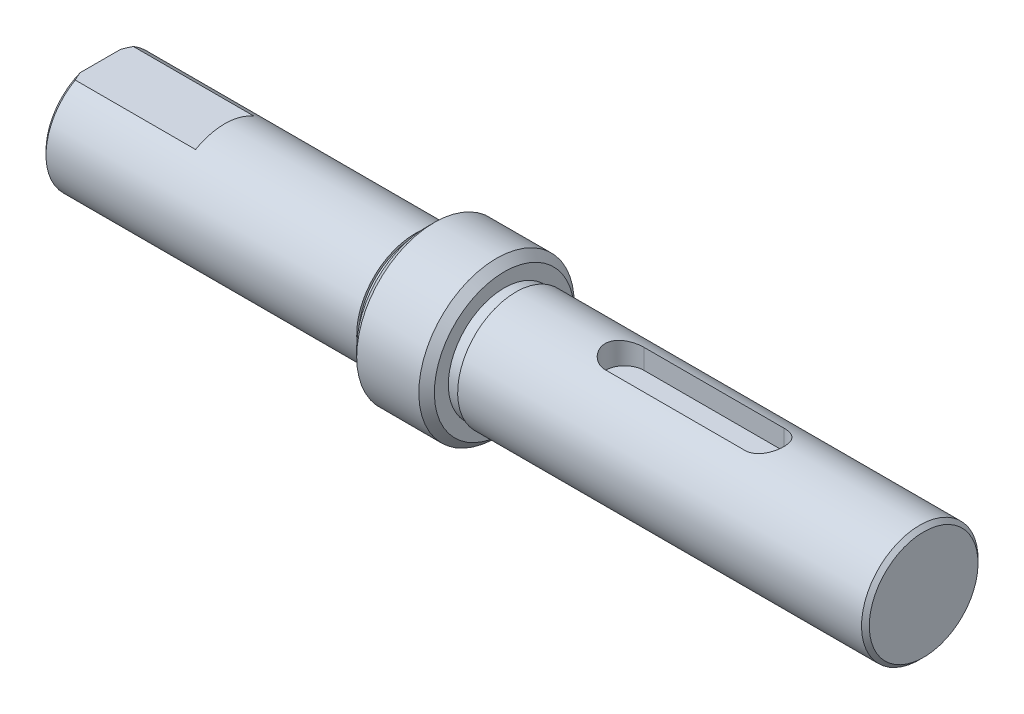
ISO-10303-21;
HEADER;
FILE_DESCRIPTION(('STEP AP214'),'2;1');
FILE_NAME('part.step','',(''),(''),'','','');
FILE_SCHEMA(('AUTOMOTIVE_DESIGN { 1 0 10303 214 1 1 1 1 }'));
ENDSEC;
DATA;
#1=APPLICATION_CONTEXT('core data for automotive mechanical design processes');
#2=APPLICATION_PROTOCOL_DEFINITION('international standard','automotive_design',2000,#1);
#3=PRODUCT_CONTEXT('',#1,'mechanical');
#4=PRODUCT('Part','Part','',(#3));
#5=PRODUCT_RELATED_PRODUCT_CATEGORY('part','',(#4));
#6=PRODUCT_DEFINITION_FORMATION('','',#4);
#7=PRODUCT_DEFINITION_CONTEXT('part definition',#1,'design');
#8=PRODUCT_DEFINITION('design','',#6,#7);
#9=PRODUCT_DEFINITION_SHAPE('','',#8);
#10=(LENGTH_UNIT() NAMED_UNIT(*) SI_UNIT(.MILLI.,.METRE.));
#11=(NAMED_UNIT(*) PLANE_ANGLE_UNIT() SI_UNIT($,.RADIAN.));
#12=(NAMED_UNIT(*) SI_UNIT($,.STERADIAN.) SOLID_ANGLE_UNIT());
#13=UNCERTAINTY_MEASURE_WITH_UNIT(LENGTH_MEASURE(1.E-05),#10,'distance_accuracy_value','');
#14=(GEOMETRIC_REPRESENTATION_CONTEXT(3) GLOBAL_UNCERTAINTY_ASSIGNED_CONTEXT((#13)) GLOBAL_UNIT_ASSIGNED_CONTEXT((#10,
#11,#12)) REPRESENTATION_CONTEXT('',''));
#15=CARTESIAN_POINT('',(0.,0.,0.));
#16=DIRECTION('',(0.,0.,1.));
#17=DIRECTION('',(1.,0.,0.));
#18=AXIS2_PLACEMENT_3D('',#15,#16,#17);
#19=CARTESIAN_POINT('',(0.,0.,0.));
#20=DIRECTION('',(1.,0.,0.));
#21=DIRECTION('',(0.,1.,0.));
#22=AXIS2_PLACEMENT_3D('',#19,#20,#21);
#23=CYLINDRICAL_SURFACE('',#22,7.49999999999996);
#24=CARTESIAN_POINT('',(105.5,0.,0.));
#25=DIRECTION('',(1.,0.,0.));
#26=DIRECTION('',(0.,1.,0.));
#27=AXIS2_PLACEMENT_3D('',#24,#25,#26);
#28=CIRCLE('',#27,7.49999999999996);
#29=CARTESIAN_POINT('',(105.5,7.49999999999997,0.));
#30=VERTEX_POINT('',#29);
#31=EDGE_CURVE('E255',#30,#30,#28,.F.);
#32=ORIENTED_EDGE('',*,*,#31,.T.);
#33=EDGE_LOOP('',(#32));
#34=FACE_BOUND('',#33,.T.);
#35=CARTESIAN_POINT('',(53.5,0.,0.));
#36=DIRECTION('',(1.,0.,0.));
#37=DIRECTION('',(0.,1.,0.));
#38=AXIS2_PLACEMENT_3D('',#35,#36,#37);
#39=CIRCLE('',#38,7.49999999999996);
#40=CARTESIAN_POINT('',(53.5,7.49999999999997,0.));
#41=VERTEX_POINT('',#40);
#42=EDGE_CURVE('E163',#41,#41,#39,.T.);
#43=ORIENTED_EDGE('',*,*,#42,.T.);
#44=EDGE_LOOP('',(#43));
#45=FACE_BOUND('',#44,.T.);
#46=DIRECTION('',(1.,0.,0.));
#47=VECTOR('',#46,1.);
#48=CARTESIAN_POINT('',(0.,7.07106781186543,2.49999999999999));
#49=LINE('',#48,#47);
#50=CARTESIAN_POINT('',(85.4999999999755,7.07106781186545,2.49999999999999));
#51=VERTEX_POINT('',#50);
#52=CARTESIAN_POINT('',(67.5000000000245,7.07106781186544,2.49999999999999));
#53=VERTEX_POINT('',#52);
#54=EDGE_CURVE('E208',#51,#53,#49,.F.);
#55=ORIENTED_EDGE('',*,*,#54,.T.);
#56=CARTESIAN_POINT('',(67.5000000000245,7.07106781186544,2.5));
#57=CARTESIAN_POINT('',(67.4317929222048,7.07105693273154,2.50000899110405));
#58=CARTESIAN_POINT('',(67.3635919253504,7.07205443904565,2.49720887221587));
#59=CARTESIAN_POINT('',(67.2277189616779,7.07598524120999,2.48606045780484));
#60=CARTESIAN_POINT('',(67.1600468570398,7.07891801450631,2.47771365997224));
#61=CARTESIAN_POINT('',(67.0259095116746,7.08662705252488,2.4555745942284));
#62=CARTESIAN_POINT('',(66.959441297479,7.09139784850095,2.44179847763194));
#63=CARTESIAN_POINT('',(66.8279917314483,7.10262619905968,2.40894181030211));
#64=CARTESIAN_POINT('',(66.7630104334419,7.1090838146029,2.38986106786142));
#65=CARTESIAN_POINT('',(66.5710384203191,7.13069940793851,2.32491551306371));
#66=CARTESIAN_POINT('',(66.4468208425649,7.14811243883975,2.27131416810479));
#67=CARTESIAN_POINT('',(66.2091231885739,7.1869703408741,2.14517784106609));
#68=CARTESIAN_POINT('',(66.0956497642582,7.20841768550949,2.07263123268959));
#69=CARTESIAN_POINT('',(65.8782070965698,7.25386182389318,1.90762995847412));
#70=CARTESIAN_POINT('',(65.7747148572734,7.2779218942789,1.81456284631521));
#71=CARTESIAN_POINT('',(65.5844828968098,7.32534626725836,1.61247071191406));
#72=CARTESIAN_POINT('',(65.4977461587253,7.34871044533307,1.50344285414663));
#73=CARTESIAN_POINT('',(65.3413017757834,7.39284706096126,1.26900922495212));
#74=CARTESIAN_POINT('',(65.2720976923043,7.41353593532672,1.14325025285825));
#75=CARTESIAN_POINT('',(65.1560192176129,7.44924021883081,0.881073095491492));
#76=CARTESIAN_POINT('',(65.1091380051223,7.46425736081023,0.74465818124342));
#77=CARTESIAN_POINT('',(65.0406607237904,7.48647677762651,0.470073371202998));
#78=CARTESIAN_POINT('',(65.0182418290916,7.49393272446042,0.332129588175044));
#79=CARTESIAN_POINT('',(64.9967092433105,7.50109021034804,0.0542474216599176));
#80=CARTESIAN_POINT('',(64.9975899991333,7.50079359709928,-0.0856904786152926));
#81=CARTESIAN_POINT('',(65.0221107104494,7.49265096581901,-0.357759612665155));
#82=CARTESIAN_POINT('',(65.0448565956535,7.48510152476627,-0.489981756399803));
#83=CARTESIAN_POINT('',(65.1109829960275,7.46367401254073,-0.748610161046758));
#84=CARTESIAN_POINT('',(65.1543646553733,7.44979559045156,-0.87501609904612));
#85=CARTESIAN_POINT('',(65.2610534242417,7.41689170678298,-1.12038155750653));
#86=CARTESIAN_POINT('',(65.3246151129044,7.39780094596236,-1.23922126409009));
#87=CARTESIAN_POINT('',(65.4696498784706,7.35645969200969,-1.46481147271656));
#88=CARTESIAN_POINT('',(65.5511278276471,7.33420833994829,-1.57155867425129));
#89=CARTESIAN_POINT('',(65.7341776250504,7.28765679857788,-1.7752433492349));
#90=CARTESIAN_POINT('',(65.8365138590707,7.26330946700836,-1.87148402898963));
#91=CARTESIAN_POINT('',(66.0561037243268,7.21618726183361,-2.04568006200839));
#92=CARTESIAN_POINT('',(66.1733621560462,7.19341289790687,-2.1236295079155));
#93=CARTESIAN_POINT('',(66.421700445921,7.15175078442236,-2.26000831393589));
#94=CARTESIAN_POINT('',(66.552958787368,7.13292537372095,-2.31813252372258));
#95=CARTESIAN_POINT('',(66.8241174440071,7.10202742656715,-2.41115057670511));
#96=CARTESIAN_POINT('',(66.9640037334613,7.08994423524141,-2.44608109009021));
#97=CARTESIAN_POINT('',(67.1710465918987,7.078413552385,-2.47914539065341));
#98=CARTESIAN_POINT('',(67.2366034746634,7.07566669238216,-2.48696265308901));
#99=CARTESIAN_POINT('',(67.3680951960257,7.07199258930222,-2.49738654012905));
#100=CARTESIAN_POINT('',(67.4340294363863,7.07106299825549,-2.49999988843846));
#101=CARTESIAN_POINT('',(67.5000000000245,7.07106781188276,-2.49999999995101));
#102=B_SPLINE_CURVE_WITH_KNOTS('',3,(#56,#57,#58,#59,#60,#61,#62,#63,#64,#65,#66,#67,#68,#69,
#70,#71,#72,#73,#74,#75,#76,#77,#78,#79,#80,#81,#82,#83,#84,#85,#86,#87,#88,#89,#90,#91,#92,#93,
#94,#95,#96,#97,#98,#99,#100,#101),.UNSPECIFIED.,.F.,.F.,(4,2,2,2,2,2,2,2,2,2,2,2,2,2,2,2,2,2,2,
2,2,2,4),(0.,0.204546211836545,0.409037215419591,0.612924429422994,0.816819012797305,
1.22401016922043,1.63145179963908,2.05327864086357,2.47518051338611,2.90809434011585,
3.34087579481239,3.75860278496568,4.17623021754306,4.57747647841692,4.97874498947627,
5.38529148741531,5.79194868148139,6.21771736820877,6.6436233729839,7.07581676494909,
7.50732520391436,7.70536340005967,7.90314555496476),.UNSPECIFIED.);
#103=CARTESIAN_POINT('',(67.5000000000245,7.07106781188276,-2.49999999995102));
#104=VERTEX_POINT('',#103);
#105=EDGE_CURVE('E233',#53,#104,#102,.T.);
#106=ORIENTED_EDGE('',*,*,#105,.T.);
#107=DIRECTION('',(1.,0.,0.));
#108=VECTOR('',#107,1.);
#109=CARTESIAN_POINT('',(0.,7.07106781188275,-2.49999999995102));
#110=LINE('',#109,#108);
#111=CARTESIAN_POINT('',(85.4999999999755,7.07106781188276,-2.49999999995102));
#112=VERTEX_POINT('',#111);
#113=EDGE_CURVE('E196',#104,#112,#110,.T.);
#114=ORIENTED_EDGE('',*,*,#113,.T.);
#115=CARTESIAN_POINT('',(85.4999999999755,7.07106781188276,-2.49999999995102));
#116=CARTESIAN_POINT('',(85.5682070777952,7.07105693274886,-2.50000899105508));
#117=CARTESIAN_POINT('',(85.6364080746497,7.07205443906295,-2.49720887216689));
#118=CARTESIAN_POINT('',(85.7722810383224,7.07598524122721,-2.48606045775583));
#119=CARTESIAN_POINT('',(85.8399531429607,7.07891801452348,-2.4777136599232));
#120=CARTESIAN_POINT('',(85.9740904883261,7.0866270525419,-2.45557459417929));
#121=CARTESIAN_POINT('',(86.0405587025218,7.09139784851787,-2.44179847758279));
#122=CARTESIAN_POINT('',(86.1720082685527,7.10262619907638,-2.40894181025286));
#123=CARTESIAN_POINT('',(86.2369895665592,7.10908381461948,-2.38986106781211));
#124=CARTESIAN_POINT('',(86.4289615796823,7.13069940795466,-2.32491551301418));
#125=CARTESIAN_POINT('',(86.5531791574367,7.14811243885555,-2.27131416805508));
#126=CARTESIAN_POINT('',(86.7908768114281,7.18697034088907,-2.14517784101594));
#127=CARTESIAN_POINT('',(86.904350235744,7.20841768552399,-2.07263123263916));
#128=CARTESIAN_POINT('',(87.1217929034326,7.25386182390658,-1.90762995842318));
#129=CARTESIAN_POINT('',(87.2252851427289,7.27792189429166,-1.81456284626404));
#130=CARTESIAN_POINT('',(87.4155171031925,7.32534626726973,-1.61247071186241));
#131=CARTESIAN_POINT('',(87.5022538412769,7.3487104453437,-1.50344285409472));
#132=CARTESIAN_POINT('',(87.6586982242185,7.39284706097022,-1.26900922489994));
#133=CARTESIAN_POINT('',(87.7279023076974,7.41353593533477,-1.14325025280607));
#134=CARTESIAN_POINT('',(87.8439807823883,7.44924021883697,-0.881073095439405));
#135=CARTESIAN_POINT('',(87.8908619948786,7.46425736081542,-0.744658181191417));
#136=CARTESIAN_POINT('',(87.9593392762101,7.48647677762975,-0.470073371151302));
#137=CARTESIAN_POINT('',(87.9817581709087,7.4939327244627,-0.332129588123572));
#138=CARTESIAN_POINT('',(88.0032907566895,7.50109021034841,-0.0542474216089764));
#139=CARTESIAN_POINT('',(88.0024100008667,7.5007935970987,0.0856904786659269));
#140=CARTESIAN_POINT('',(87.9778892895505,7.49265096581661,0.357759612715348));
#141=CARTESIAN_POINT('',(87.9551434043463,7.48510152476299,0.489981756449861));
#142=CARTESIAN_POINT('',(87.8890170039723,7.46367401253574,0.748610161096512));
#143=CARTESIAN_POINT('',(87.8456353446265,7.44979559044573,0.875016099095706));
#144=CARTESIAN_POINT('',(87.738946575758,7.41689170677551,1.120381557556));
#145=CARTESIAN_POINT('',(87.6753848870953,7.39780094595407,1.2392212641396));
#146=CARTESIAN_POINT('',(87.530350121529,7.35645969199982,1.46481147276614));
#147=CARTESIAN_POINT('',(87.4488721723524,7.33420833993767,1.57155867430089));
#148=CARTESIAN_POINT('',(87.2658223749489,7.28765679856578,1.77524334928462));
#149=CARTESIAN_POINT('',(87.1634861409284,7.26330946699554,1.87148402903943));
#150=CARTESIAN_POINT('',(86.9438962756719,7.21618726181946,2.04568006205831));
#151=CARTESIAN_POINT('',(86.8266378439522,7.19341289789212,2.12362950796546));
#152=CARTESIAN_POINT('',(86.5782995540771,7.15175078440659,2.26000831398581));
#153=CARTESIAN_POINT('',(86.4470412126299,7.13292537370475,2.31813252377243));
#154=CARTESIAN_POINT('',(86.1758825559905,7.10202742655029,2.41115057675478));
#155=CARTESIAN_POINT('',(86.035996266536,7.08994423522431,2.44608109013977));
#156=CARTESIAN_POINT('',(85.828953408099,7.07841355236775,2.47914539070268));
#157=CARTESIAN_POINT('',(85.7633965253347,7.07566669236488,2.48696265313817));
#158=CARTESIAN_POINT('',(85.6319048039734,7.07199258928491,2.49738654017806));
#159=CARTESIAN_POINT('',(85.5659705636132,7.07106299823817,2.49999988848744));
#160=CARTESIAN_POINT('',(85.4999999999755,7.07106781186545,2.49999999999999));
#161=B_SPLINE_CURVE_WITH_KNOTS('',3,(#115,#116,#117,#118,#119,#120,#121,#122,#123,#124,#125,
#126,#127,#128,#129,#130,#131,#132,#133,#134,#135,#136,#137,#138,#139,#140,#141,#142,#143,#144,
#145,#146,#147,#148,#149,#150,#151,#152,#153,#154,#155,#156,#157,#158,#159,#160),.UNSPECIFIED.,
.F.,.F.,(4,2,2,2,2,2,2,2,2,2,2,2,2,2,2,2,2,2,2,2,2,2,4),(0.,0.204546211836823,0.409037215420173,
0.612924429423895,0.816819012798513,1.22401016922227,1.63145179964155,2.05327864086614,
2.4751805133888,2.90809434011778,3.34087579481357,3.75860278496595,4.17623021754244,
4.57747647841607,4.9787449894752,5.38529148741479,5.7919486814814,6.21771736820969,
6.64362337298575,7.07581676495143,7.50732520391718,7.70536340006106,7.90314555496476),.UNSPECIFIED.);
#162=EDGE_CURVE('E199',#112,#51,#161,.T.);
#163=ORIENTED_EDGE('',*,*,#162,.T.);
#164=EDGE_LOOP('',(#55,#106,#114,#163));
#165=FACE_BOUND('',#164,.T.);
#166=ADVANCED_FACE('F34',(#34,#45,#165),#23,.T.);
#167=CARTESIAN_POINT('',(0.,0.,0.));
#168=DIRECTION('',(-1.,0.,0.));
#169=DIRECTION('',(0.,-1.,0.));
#170=AXIS2_PLACEMENT_3D('',#167,#168,#169);
#171=PLANE('',#170);
#172=CARTESIAN_POINT('',(0.,0.,0.));
#173=DIRECTION('',(-1.,0.,0.));
#174=DIRECTION('',(0.,0.,1.));
#175=AXIS2_PLACEMENT_3D('',#172,#173,#174);
#176=CIRCLE('',#175,2.5);
#177=CARTESIAN_POINT('',(0.,0.,2.5));
#178=VERTEX_POINT('',#177);
#179=EDGE_CURVE('E347',#178,#178,#176,.T.);
#180=ORIENTED_EDGE('',*,*,#179,.F.);
#181=EDGE_LOOP('',(#180));
#182=FACE_BOUND('',#181,.T.);
#183=DIRECTION('',(0.,0.,1.));
#184=VECTOR('',#183,1.);
#185=CARTESIAN_POINT('',(0.,6.5,-9.99999999999997));
#186=LINE('',#185,#184);
#187=CARTESIAN_POINT('',(0.,6.5,-2.59807621135322));
#188=VERTEX_POINT('',#187);
#189=CARTESIAN_POINT('',(0.,6.5,2.59807621135322));
#190=VERTEX_POINT('',#189);
#191=EDGE_CURVE('E157',#188,#190,#186,.T.);
#192=ORIENTED_EDGE('',*,*,#191,.F.);
#193=CARTESIAN_POINT('',(0.,0.,0.));
#194=DIRECTION('',(-1.,0.,0.));
#195=DIRECTION('',(0.,-1.,0.));
#196=AXIS2_PLACEMENT_3D('',#193,#194,#195);
#197=CIRCLE('',#196,6.99999999999996);
#198=CARTESIAN_POINT('',(0.,-6.5,-2.59807621135322));
#199=VERTEX_POINT('',#198);
#200=EDGE_CURVE('E61',#188,#199,#197,.T.);
#201=ORIENTED_EDGE('',*,*,#200,.T.);
#202=DIRECTION('',(0.,0.,1.));
#203=VECTOR('',#202,1.);
#204=CARTESIAN_POINT('',(0.,-6.5,-9.99999999999997));
#205=LINE('',#204,#203);
#206=CARTESIAN_POINT('',(0.,-6.5,2.59807621135322));
#207=VERTEX_POINT('',#206);
#208=EDGE_CURVE('E155',#199,#207,#205,.T.);
#209=ORIENTED_EDGE('',*,*,#208,.T.);
#210=CARTESIAN_POINT('',(0.,0.,0.));
#211=DIRECTION('',(-1.,0.,0.));
#212=DIRECTION('',(0.,-1.,0.));
#213=AXIS2_PLACEMENT_3D('',#210,#211,#212);
#214=CIRCLE('',#213,6.99999999999996);
#215=EDGE_CURVE('E351',#207,#190,#214,.T.);
#216=ORIENTED_EDGE('',*,*,#215,.T.);
#217=EDGE_LOOP('',(#192,#201,#209,#216));
#218=FACE_BOUND('',#217,.T.);
#219=ADVANCED_FACE('F296',(#182,#218),#171,.T.);
#220=CARTESIAN_POINT('',(0.,0.,0.));
#221=DIRECTION('',(1.,0.,0.));
#222=DIRECTION('',(0.,1.,0.));
#223=AXIS2_PLACEMENT_3D('',#220,#221,#222);
#224=CYLINDRICAL_SURFACE('',#223,7.49999999999997);
#225=DIRECTION('',(1.,0.,0.));
#226=VECTOR('',#225,1.);
#227=CARTESIAN_POINT('',(0.,-6.5,-3.74165738677388));
#228=LINE('',#227,#226);
#229=CARTESIAN_POINT('',(0.500000000000006,-6.5,-3.74165738677388));
#230=VERTEX_POINT('',#229);
#231=CARTESIAN_POINT('',(16.,-6.5,-3.74165738677388));
#232=VERTEX_POINT('',#231);
#233=EDGE_CURVE('E192',#230,#232,#228,.T.);
#234=ORIENTED_EDGE('',*,*,#233,.F.);
#235=CARTESIAN_POINT('',(0.500000000000005,0.,0.));
#236=DIRECTION('',(-1.,0.,0.));
#237=DIRECTION('',(0.,-1.,0.));
#238=AXIS2_PLACEMENT_3D('',#235,#236,#237);
#239=CIRCLE('',#238,7.49999999999997);
#240=CARTESIAN_POINT('',(0.500000000000004,6.5,-3.74165738677388));
#241=VERTEX_POINT('',#240);
#242=EDGE_CURVE('E261',#230,#241,#239,.F.);
#243=ORIENTED_EDGE('',*,*,#242,.T.);
#244=DIRECTION('',(1.,0.,0.));
#245=VECTOR('',#244,1.);
#246=CARTESIAN_POINT('',(0.,6.5,-3.74165738677388));
#247=LINE('',#246,#245);
#248=CARTESIAN_POINT('',(16.,6.5,-3.74165738677388));
#249=VERTEX_POINT('',#248);
#250=EDGE_CURVE('E187',#249,#241,#247,.F.);
#251=ORIENTED_EDGE('',*,*,#250,.F.);
#252=CARTESIAN_POINT('',(16.,0.,0.));
#253=DIRECTION('',(1.,0.,0.));
#254=DIRECTION('',(0.,1.,0.));
#255=AXIS2_PLACEMENT_3D('',#252,#253,#254);
#256=CIRCLE('',#255,7.49999999999997);
#257=CARTESIAN_POINT('',(16.,6.5,3.74165738677388));
#258=VERTEX_POINT('',#257);
#259=EDGE_CURVE('E185',#258,#249,#256,.F.);
#260=ORIENTED_EDGE('',*,*,#259,.F.);
#261=DIRECTION('',(1.,0.,0.));
#262=VECTOR('',#261,1.);
#263=CARTESIAN_POINT('',(0.,6.5,3.74165738677388));
#264=LINE('',#263,#262);
#265=CARTESIAN_POINT('',(0.500000000000004,6.5,3.74165738677388));
#266=VERTEX_POINT('',#265);
#267=EDGE_CURVE('E183',#266,#258,#264,.T.);
#268=ORIENTED_EDGE('',*,*,#267,.F.);
#269=CARTESIAN_POINT('',(0.500000000000005,0.,0.));
#270=DIRECTION('',(-1.,0.,0.));
#271=DIRECTION('',(0.,-1.,0.));
#272=AXIS2_PLACEMENT_3D('',#269,#270,#271);
#273=CIRCLE('',#272,7.49999999999997);
#274=CARTESIAN_POINT('',(0.500000000000006,-6.5,3.74165738677388));
#275=VERTEX_POINT('',#274);
#276=EDGE_CURVE('E258',#266,#275,#273,.F.);
#277=ORIENTED_EDGE('',*,*,#276,.T.);
#278=DIRECTION('',(1.,0.,0.));
#279=VECTOR('',#278,1.);
#280=CARTESIAN_POINT('',(0.,-6.5,3.74165738677388));
#281=LINE('',#280,#279);
#282=CARTESIAN_POINT('',(16.,-6.5,3.74165738677388));
#283=VERTEX_POINT('',#282);
#284=EDGE_CURVE('E194',#283,#275,#281,.F.);
#285=ORIENTED_EDGE('',*,*,#284,.F.);
#286=CARTESIAN_POINT('',(16.,0.,0.));
#287=DIRECTION('',(1.,0.,0.));
#288=DIRECTION('',(0.,0.,-1.));
#289=AXIS2_PLACEMENT_3D('',#286,#287,#288);
#290=CIRCLE('',#289,7.49999999999997);
#291=EDGE_CURVE('E190',#232,#283,#290,.F.);
#292=ORIENTED_EDGE('',*,*,#291,.F.);
#293=EDGE_LOOP('',(#234,#243,#251,#260,#268,#277,#285,#292));
#294=FACE_BOUND('',#293,.T.);
#295=CARTESIAN_POINT('',(40.5,0.,0.));
#296=DIRECTION('',(1.,0.,0.));
#297=DIRECTION('',(0.,1.,0.));
#298=AXIS2_PLACEMENT_3D('',#295,#296,#297);
#299=CIRCLE('',#298,7.49999999999996);
#300=CARTESIAN_POINT('',(40.5,7.49999999999997,0.));
#301=VERTEX_POINT('',#300);
#302=EDGE_CURVE('E180',#301,#301,#299,.T.);
#303=ORIENTED_EDGE('',*,*,#302,.F.);
#304=EDGE_LOOP('',(#303));
#305=FACE_BOUND('',#304,.T.);
#306=ADVANCED_FACE('F301',(#294,#305),#224,.T.);
#307=CARTESIAN_POINT('',(40.5,7.49999999999997,0.));
#308=DIRECTION('',(1.,0.,0.));
#309=DIRECTION('',(0.,1.,0.));
#310=AXIS2_PLACEMENT_3D('',#307,#308,#309);
#311=PLANE('',#310);
#312=ORIENTED_EDGE('',*,*,#302,.T.);
#313=EDGE_LOOP('',(#312));
#314=FACE_BOUND('',#313,.T.);
#315=CARTESIAN_POINT('',(40.5,0.,0.));
#316=DIRECTION('',(1.,0.,0.));
#317=DIRECTION('',(0.,1.,0.));
#318=AXIS2_PLACEMENT_3D('',#315,#316,#317);
#319=CIRCLE('',#318,7.19999999999996);
#320=CARTESIAN_POINT('',(40.5,7.19999999999997,0.));
#321=VERTEX_POINT('',#320);
#322=EDGE_CURVE('E177',#321,#321,#319,.T.);
#323=ORIENTED_EDGE('',*,*,#322,.F.);
#324=EDGE_LOOP('',(#323));
#325=FACE_BOUND('',#324,.T.);
#326=ADVANCED_FACE('F518',(#314,#325),#311,.T.);
#327=CARTESIAN_POINT('',(0.,0.,0.));
#328=DIRECTION('',(1.,0.,0.));
#329=DIRECTION('',(0.,1.,0.));
#330=AXIS2_PLACEMENT_3D('',#327,#328,#329);
#331=CYLINDRICAL_SURFACE('',#330,7.19999999999996);
#332=ORIENTED_EDGE('',*,*,#322,.T.);
#333=EDGE_LOOP('',(#332));
#334=FACE_BOUND('',#333,.T.);
#335=CARTESIAN_POINT('',(42.,0.,0.));
#336=DIRECTION('',(1.,0.,0.));
#337=DIRECTION('',(0.,1.,0.));
#338=AXIS2_PLACEMENT_3D('',#335,#336,#337);
#339=CIRCLE('',#338,7.19999999999996);
#340=CARTESIAN_POINT('',(42.,7.19999999999997,0.));
#341=VERTEX_POINT('',#340);
#342=EDGE_CURVE('E174',#341,#341,#339,.T.);
#343=ORIENTED_EDGE('',*,*,#342,.F.);
#344=EDGE_LOOP('',(#343));
#345=FACE_BOUND('',#344,.T.);
#346=ADVANCED_FACE('F460',(#334,#345),#331,.T.);
#347=CARTESIAN_POINT('',(42.,7.19999999999997,0.));
#348=DIRECTION('',(-1.,0.,0.));
#349=DIRECTION('',(0.,-1.,0.));
#350=AXIS2_PLACEMENT_3D('',#347,#348,#349);
#351=PLANE('',#350);
#352=CARTESIAN_POINT('',(42.,0.,0.));
#353=DIRECTION('',(-1.,0.,0.));
#354=DIRECTION('',(0.,-1.,0.));
#355=AXIS2_PLACEMENT_3D('',#352,#353,#354);
#356=CIRCLE('',#355,8.99999999999998);
#357=CARTESIAN_POINT('',(42.,-8.99999999999997,0.));
#358=VERTEX_POINT('',#357);
#359=EDGE_CURVE('E249',#358,#358,#356,.T.);
#360=ORIENTED_EDGE('',*,*,#359,.T.);
#361=EDGE_LOOP('',(#360));
#362=FACE_BOUND('',#361,.T.);
#363=ORIENTED_EDGE('',*,*,#342,.T.);
#364=EDGE_LOOP('',(#363));
#365=FACE_BOUND('',#364,.T.);
#366=ADVANCED_FACE('F454',(#362,#365),#351,.T.);
#367=CARTESIAN_POINT('',(0.,0.,0.));
#368=DIRECTION('',(1.,0.,0.));
#369=DIRECTION('',(0.,1.,0.));
#370=AXIS2_PLACEMENT_3D('',#367,#368,#369);
#371=CYLINDRICAL_SURFACE('',#370,9.99999999999997);
#372=CARTESIAN_POINT('',(51.,0.,0.));
#373=DIRECTION('',(1.,0.,0.));
#374=DIRECTION('',(0.,1.,0.));
#375=AXIS2_PLACEMENT_3D('',#372,#373,#374);
#376=CIRCLE('',#375,9.99999999999997);
#377=CARTESIAN_POINT('',(51.,9.99999999999998,0.));
#378=VERTEX_POINT('',#377);
#379=EDGE_CURVE('E246',#378,#378,#376,.F.);
#380=ORIENTED_EDGE('',*,*,#379,.T.);
#381=EDGE_LOOP('',(#380));
#382=FACE_BOUND('',#381,.T.);
#383=CARTESIAN_POINT('',(43.,0.,0.));
#384=DIRECTION('',(-1.,0.,0.));
#385=DIRECTION('',(0.,-1.,0.));
#386=AXIS2_PLACEMENT_3D('',#383,#384,#385);
#387=CIRCLE('',#386,9.99999999999997);
#388=CARTESIAN_POINT('',(43.,-9.99999999999997,0.));
#389=VERTEX_POINT('',#388);
#390=EDGE_CURVE('E243',#389,#389,#387,.F.);
#391=ORIENTED_EDGE('',*,*,#390,.T.);
#392=EDGE_LOOP('',(#391));
#393=FACE_BOUND('',#392,.T.);
#394=ADVANCED_FACE('F459',(#382,#393),#371,.T.);
#395=CARTESIAN_POINT('',(52.,9.99999999999998,0.));
#396=DIRECTION('',(1.,0.,0.));
#397=DIRECTION('',(0.,1.,0.));
#398=AXIS2_PLACEMENT_3D('',#395,#396,#397);
#399=PLANE('',#398);
#400=CARTESIAN_POINT('',(52.,0.,0.));
#401=DIRECTION('',(1.,0.,0.));
#402=DIRECTION('',(0.,1.,0.));
#403=AXIS2_PLACEMENT_3D('',#400,#401,#402);
#404=CIRCLE('',#403,8.99999999999998);
#405=CARTESIAN_POINT('',(52.,8.99999999999998,0.));
#406=VERTEX_POINT('',#405);
#407=EDGE_CURVE('E240',#406,#406,#404,.T.);
#408=ORIENTED_EDGE('',*,*,#407,.T.);
#409=EDGE_LOOP('',(#408));
#410=FACE_BOUND('',#409,.T.);
#411=CARTESIAN_POINT('',(52.,0.,0.));
#412=DIRECTION('',(1.,0.,0.));
#413=DIRECTION('',(0.,1.,0.));
#414=AXIS2_PLACEMENT_3D('',#411,#412,#413);
#415=CIRCLE('',#414,7.19999999999996);
#416=CARTESIAN_POINT('',(52.,7.19999999999997,0.));
#417=VERTEX_POINT('',#416);
#418=EDGE_CURVE('E171',#417,#417,#415,.T.);
#419=ORIENTED_EDGE('',*,*,#418,.F.);
#420=EDGE_LOOP('',(#419));
#421=FACE_BOUND('',#420,.T.);
#422=ADVANCED_FACE('F472',(#410,#421),#399,.T.);
#423=CARTESIAN_POINT('',(0.,0.,0.));
#424=DIRECTION('',(1.,0.,0.));
#425=DIRECTION('',(0.,1.,0.));
#426=AXIS2_PLACEMENT_3D('',#423,#424,#425);
#427=CYLINDRICAL_SURFACE('',#426,7.19999999999996);
#428=ORIENTED_EDGE('',*,*,#418,.T.);
#429=EDGE_LOOP('',(#428));
#430=FACE_BOUND('',#429,.T.);
#431=CARTESIAN_POINT('',(53.5,0.,0.));
#432=DIRECTION('',(1.,0.,0.));
#433=DIRECTION('',(0.,1.,0.));
#434=AXIS2_PLACEMENT_3D('',#431,#432,#433);
#435=CIRCLE('',#434,7.19999999999996);
#436=CARTESIAN_POINT('',(53.5,7.19999999999997,0.));
#437=VERTEX_POINT('',#436);
#438=EDGE_CURVE('E168',#437,#437,#435,.T.);
#439=ORIENTED_EDGE('',*,*,#438,.F.);
#440=EDGE_LOOP('',(#439));
#441=FACE_BOUND('',#440,.T.);
#442=ADVANCED_FACE('F293',(#430,#441),#427,.T.);
#443=CARTESIAN_POINT('',(53.5,7.19999999999997,0.));
#444=DIRECTION('',(-1.,0.,0.));
#445=DIRECTION('',(0.,-1.,0.));
#446=AXIS2_PLACEMENT_3D('',#443,#444,#445);
#447=PLANE('',#446);
#448=ORIENTED_EDGE('',*,*,#438,.T.);
#449=EDGE_LOOP('',(#448));
#450=FACE_BOUND('',#449,.T.);
#451=ORIENTED_EDGE('',*,*,#42,.F.);
#452=EDGE_LOOP('',(#451));
#453=FACE_BOUND('',#452,.T.);
#454=ADVANCED_FACE('F288',(#450,#453),#447,.T.);
#455=CARTESIAN_POINT('',(106.,7.49999999999997,0.));
#456=DIRECTION('',(1.,0.,0.));
#457=DIRECTION('',(0.,1.,0.));
#458=AXIS2_PLACEMENT_3D('',#455,#456,#457);
#459=PLANE('',#458);
#460=CARTESIAN_POINT('',(106.,0.,0.));
#461=DIRECTION('',(1.,0.,0.));
#462=DIRECTION('',(0.,1.,0.));
#463=AXIS2_PLACEMENT_3D('',#460,#461,#462);
#464=CIRCLE('',#463,6.99999999999998);
#465=CARTESIAN_POINT('',(106.,6.99999999999999,0.));
#466=VERTEX_POINT('',#465);
#467=EDGE_CURVE('E252',#466,#466,#464,.T.);
#468=ORIENTED_EDGE('',*,*,#467,.T.);
#469=EDGE_LOOP('',(#468));
#470=FACE_BOUND('',#469,.T.);
#471=ADVANCED_FACE('F285',(#470),#459,.T.);
#472=CARTESIAN_POINT('',(16.,6.5,-9.99999999999997));
#473=DIRECTION('',(1.,0.,0.));
#474=DIRECTION('',(0.,1.,0.));
#475=AXIS2_PLACEMENT_3D('',#472,#473,#474);
#476=PLANE('',#475);
#477=ORIENTED_EDGE('',*,*,#259,.T.);
#478=DIRECTION('',(0.,0.,1.));
#479=VECTOR('',#478,1.);
#480=CARTESIAN_POINT('',(16.,6.5,-9.99999999999997));
#481=LINE('',#480,#479);
#482=EDGE_CURVE('E160',#249,#258,#481,.T.);
#483=ORIENTED_EDGE('',*,*,#482,.T.);
#484=EDGE_LOOP('',(#477,#483));
#485=FACE_BOUND('',#484,.T.);
#486=ADVANCED_FACE('F281',(#485),#476,.F.);
#487=CARTESIAN_POINT('',(16.,6.5,-9.99999999999997));
#488=DIRECTION('',(0.,-1.,0.));
#489=DIRECTION('',(1.,0.,0.));
#490=AXIS2_PLACEMENT_3D('',#487,#488,#489);
#491=PLANE('',#490);
#492=ORIENTED_EDGE('',*,*,#250,.T.);
#493=CARTESIAN_POINT('',(0.500000000000004,6.5,-3.74165738677388));
#494=CARTESIAN_POINT('',(0.453535504056639,6.5,-3.64851517289647));
#495=CARTESIAN_POINT('',(0.408107259758502,6.5,-3.55484974318803));
#496=CARTESIAN_POINT('',(0.319591651075269,6.5,-3.36650238385657));
#497=CARTESIAN_POINT('',(0.276502629455996,6.5,-3.27182123231758));
#498=CARTESIAN_POINT('',(0.192863066931701,6.5,-3.08133102900943));
#499=CARTESIAN_POINT('',(0.152312731418809,6.5,-2.98552188672339));
#500=CARTESIAN_POINT('',(0.0739933775286053,6.5,-2.79269458247037));
#501=CARTESIAN_POINT('',(0.0362263787623943,6.5,-2.69567560116993));
#502=CARTESIAN_POINT('',(0.,6.5,-2.59807621135322));
#503=B_SPLINE_CURVE_WITH_KNOTS('',3,(#493,#494,#495,#496,#497,#498,#499,#500,#501,#502),
.UNSPECIFIED.,.F.,.F.,(4,2,2,2,4),(0.,0.312267207174203,0.624310219975612,0.936378446045579,
1.24867092620927),.UNSPECIFIED.);
#504=EDGE_CURVE('E271',#241,#188,#503,.T.);
#505=ORIENTED_EDGE('',*,*,#504,.T.);
#506=ORIENTED_EDGE('',*,*,#191,.T.);
#507=CARTESIAN_POINT('',(0.,6.5,2.59807621135322));
#508=CARTESIAN_POINT('',(0.0362263787623942,6.5,2.69567560116993));
#509=CARTESIAN_POINT('',(0.0739933775286053,6.5,2.79269458247037));
#510=CARTESIAN_POINT('',(0.152312731418809,6.5,2.98552188672339));
#511=CARTESIAN_POINT('',(0.1928630669317,6.5,3.08133102900943));
#512=CARTESIAN_POINT('',(0.276502629455995,6.5,3.27182123231758));
#513=CARTESIAN_POINT('',(0.319591651075269,6.5,3.36650238385657));
#514=CARTESIAN_POINT('',(0.408107259758502,6.5,3.55484974318803));
#515=CARTESIAN_POINT('',(0.453535504056639,6.5,3.64851517289647));
#516=CARTESIAN_POINT('',(0.500000000000004,6.5,3.74165738677387));
#517=B_SPLINE_CURVE_WITH_KNOTS('',3,(#507,#508,#509,#510,#511,#512,#513,#514,#515,#516),
.UNSPECIFIED.,.F.,.F.,(4,2,2,2,4),(0.,0.31229248016369,0.624360706233656,0.936403719035065,
1.24867092620927),.UNSPECIFIED.);
#518=EDGE_CURVE('E264',#190,#266,#517,.T.);
#519=ORIENTED_EDGE('',*,*,#518,.T.);
#520=ORIENTED_EDGE('',*,*,#267,.T.);
#521=ORIENTED_EDGE('',*,*,#482,.F.);
#522=EDGE_LOOP('',(#492,#505,#506,#519,#520,#521));
#523=FACE_BOUND('',#522,.T.);
#524=ADVANCED_FACE('F277',(#523),#491,.F.);
#525=CARTESIAN_POINT('',(0.,-6.5,-9.99999999999997));
#526=DIRECTION('',(0.,1.,0.));
#527=DIRECTION('',(-1.,0.,0.));
#528=AXIS2_PLACEMENT_3D('',#525,#526,#527);
#529=PLANE('',#528);
#530=ORIENTED_EDGE('',*,*,#208,.F.);
#531=CARTESIAN_POINT('',(0.,-6.5,-2.59807621135322));
#532=CARTESIAN_POINT('',(0.0362263787623959,-6.5,-2.69567560116993));
#533=CARTESIAN_POINT('',(0.073993377528607,-6.5,-2.79269458247037));
#534=CARTESIAN_POINT('',(0.15231273141881,-6.5,-2.98552188672339));
#535=CARTESIAN_POINT('',(0.192863066931702,-6.5,-3.08133102900943));
#536=CARTESIAN_POINT('',(0.276502629455997,-6.5,-3.27182123231758));
#537=CARTESIAN_POINT('',(0.319591651075271,-6.5,-3.36650238385657));
#538=CARTESIAN_POINT('',(0.408107259758504,-6.5,-3.55484974318803));
#539=CARTESIAN_POINT('',(0.453535504056641,-6.5,-3.64851517289647));
#540=CARTESIAN_POINT('',(0.500000000000006,-6.5,-3.74165738677388));
#541=B_SPLINE_CURVE_WITH_KNOTS('',3,(#531,#532,#533,#534,#535,#536,#537,#538,#539,#540),
.UNSPECIFIED.,.F.,.F.,(4,2,2,2,4),(0.,0.31229248016369,0.624360706233656,0.936403719035065,
1.24867092620927),.UNSPECIFIED.);
#542=EDGE_CURVE('E11',#199,#230,#541,.T.);
#543=ORIENTED_EDGE('',*,*,#542,.T.);
#544=ORIENTED_EDGE('',*,*,#233,.T.);
#545=DIRECTION('',(0.,0.,1.));
#546=VECTOR('',#545,1.);
#547=CARTESIAN_POINT('',(16.,-6.5,-9.99999999999997));
#548=LINE('',#547,#546);
#549=EDGE_CURVE('E154',#232,#283,#548,.T.);
#550=ORIENTED_EDGE('',*,*,#549,.T.);
#551=ORIENTED_EDGE('',*,*,#284,.T.);
#552=CARTESIAN_POINT('',(0.500000000000006,-6.5,3.74165738677388));
#553=CARTESIAN_POINT('',(0.45353550405664,-6.5,3.64851517289647));
#554=CARTESIAN_POINT('',(0.408107259758504,-6.5,3.55484974318803));
#555=CARTESIAN_POINT('',(0.319591651075271,-6.5,3.36650238385657));
#556=CARTESIAN_POINT('',(0.276502629455997,-6.5,3.27182123231758));
#557=CARTESIAN_POINT('',(0.192863066931702,-6.5,3.08133102900943));
#558=CARTESIAN_POINT('',(0.152312731418811,-6.5,2.98552188672339));
#559=CARTESIAN_POINT('',(0.0739933775286069,-6.5,2.79269458247037));
#560=CARTESIAN_POINT('',(0.0362263787623957,-6.5,2.69567560116993));
#561=CARTESIAN_POINT('',(0.,-6.5,2.59807621135322));
#562=B_SPLINE_CURVE_WITH_KNOTS('',3,(#552,#553,#554,#555,#556,#557,#558,#559,#560,#561),
.UNSPECIFIED.,.F.,.F.,(4,2,2,2,4),(0.,0.312267207174203,0.624310219975612,0.936378446045579,
1.24867092620927),.UNSPECIFIED.);
#563=EDGE_CURVE('E48',#275,#207,#562,.T.);
#564=ORIENTED_EDGE('',*,*,#563,.T.);
#565=EDGE_LOOP('',(#530,#543,#544,#550,#551,#564));
#566=FACE_BOUND('',#565,.T.);
#567=ADVANCED_FACE('F230',(#566),#529,.F.);
#568=CARTESIAN_POINT('',(16.,-6.5,-9.99999999999997));
#569=DIRECTION('',(1.,0.,0.));
#570=DIRECTION('',(0.,0.,-1.));
#571=AXIS2_PLACEMENT_3D('',#568,#569,#570);
#572=PLANE('',#571);
#573=ORIENTED_EDGE('',*,*,#291,.T.);
#574=ORIENTED_EDGE('',*,*,#549,.F.);
#575=EDGE_LOOP('',(#573,#574));
#576=FACE_BOUND('',#575,.T.);
#577=ADVANCED_FACE('F228',(#576),#572,.F.);
#578=CARTESIAN_POINT('',(67.5000000000245,9.99999999999998,2.44929359829471E-11));
#579=DIRECTION('',(0.,-1.,0.));
#580=DIRECTION('',(0.,0.,-1.));
#581=AXIS2_PLACEMENT_3D('',#578,#579,#580);
#582=CYLINDRICAL_SURFACE('',#581,2.49999999997551);
#583=DIRECTION('',(0.,-1.,0.));
#584=VECTOR('',#583,1.);
#585=CARTESIAN_POINT('',(67.5000000000245,9.99999999999998,2.49999999999999));
#586=LINE('',#585,#584);
#587=CARTESIAN_POINT('',(67.5000000000245,4.5,2.49999999999999));
#588=VERTEX_POINT('',#587);
#589=EDGE_CURVE('E152',#53,#588,#586,.T.);
#590=ORIENTED_EDGE('',*,*,#589,.T.);
#591=CARTESIAN_POINT('',(67.5000000000245,4.5,2.44929359829471E-11));
#592=DIRECTION('',(0.,1.,0.));
#593=DIRECTION('',(0.,0.,1.));
#594=AXIS2_PLACEMENT_3D('',#591,#592,#593);
#595=CIRCLE('',#594,2.49999999997551);
#596=CARTESIAN_POINT('',(67.5000000000245,4.5,-2.49999999995102));
#597=VERTEX_POINT('',#596);
#598=EDGE_CURVE('E127',#597,#588,#595,.T.);
#599=ORIENTED_EDGE('',*,*,#598,.F.);
#600=DIRECTION('',(0.,-1.,0.));
#601=VECTOR('',#600,1.);
#602=CARTESIAN_POINT('',(67.5000000000245,9.99999999999998,-2.49999999995102));
#603=LINE('',#602,#601);
#604=EDGE_CURVE('E146',#104,#597,#603,.T.);
#605=ORIENTED_EDGE('',*,*,#604,.F.);
#606=ORIENTED_EDGE('',*,*,#105,.F.);
#607=EDGE_LOOP('',(#590,#599,#605,#606));
#608=FACE_BOUND('',#607,.T.);
#609=ADVANCED_FACE('F224',(#608),#582,.F.);
#610=CARTESIAN_POINT('',(67.5000000000245,9.99999999999998,2.49999999999999));
#611=DIRECTION('',(0.,0.,-1.));
#612=DIRECTION('',(-1.,0.,0.));
#613=AXIS2_PLACEMENT_3D('',#610,#611,#612);
#614=PLANE('',#613);
#615=DIRECTION('',(0.,-1.,0.));
#616=VECTOR('',#615,1.);
#617=CARTESIAN_POINT('',(85.4999999999755,9.99999999999998,2.49999999999999));
#618=LINE('',#617,#616);
#619=CARTESIAN_POINT('',(85.4999999999755,4.5,2.49999999999999));
#620=VERTEX_POINT('',#619);
#621=EDGE_CURVE('E150',#51,#620,#618,.T.);
#622=ORIENTED_EDGE('',*,*,#621,.T.);
#623=DIRECTION('',(1.,0.,0.));
#624=VECTOR('',#623,1.);
#625=CARTESIAN_POINT('',(67.5000000000245,4.5,2.49999999999999));
#626=LINE('',#625,#624);
#627=EDGE_CURVE('E131',#588,#620,#626,.T.);
#628=ORIENTED_EDGE('',*,*,#627,.F.);
#629=ORIENTED_EDGE('',*,*,#589,.F.);
#630=ORIENTED_EDGE('',*,*,#54,.F.);
#631=EDGE_LOOP('',(#622,#628,#629,#630));
#632=FACE_BOUND('',#631,.T.);
#633=ADVANCED_FACE('F219',(#632),#614,.T.);
#634=CARTESIAN_POINT('',(85.4999999999755,9.99999999999998,2.44846083847129E-11));
#635=DIRECTION('',(0.,-1.,0.));
#636=DIRECTION('',(0.,0.,-1.));
#637=AXIS2_PLACEMENT_3D('',#634,#635,#636);
#638=CYLINDRICAL_SURFACE('',#637,2.49999999997551);
#639=DIRECTION('',(0.,-1.,0.));
#640=VECTOR('',#639,1.);
#641=CARTESIAN_POINT('',(85.4999999999755,9.99999999999998,-2.49999999995102));
#642=LINE('',#641,#640);
#643=CARTESIAN_POINT('',(85.4999999999755,4.5,-2.49999999995102));
#644=VERTEX_POINT('',#643);
#645=EDGE_CURVE('E148',#112,#644,#642,.T.);
#646=ORIENTED_EDGE('',*,*,#645,.T.);
#647=CARTESIAN_POINT('',(85.4999999999755,4.5,2.44846083847129E-11));
#648=DIRECTION('',(0.,1.,0.));
#649=DIRECTION('',(0.,0.,1.));
#650=AXIS2_PLACEMENT_3D('',#647,#648,#649);
#651=CIRCLE('',#650,2.49999999997551);
#652=EDGE_CURVE('E140',#620,#644,#651,.T.);
#653=ORIENTED_EDGE('',*,*,#652,.F.);
#654=ORIENTED_EDGE('',*,*,#621,.F.);
#655=ORIENTED_EDGE('',*,*,#162,.F.);
#656=EDGE_LOOP('',(#646,#653,#654,#655));
#657=FACE_BOUND('',#656,.T.);
#658=ADVANCED_FACE('F213',(#657),#638,.F.);
#659=CARTESIAN_POINT('',(67.5000000000245,9.99999999999998,-2.49999999995102));
#660=DIRECTION('',(0.,0.,1.));
#661=DIRECTION('',(1.,0.,0.));
#662=AXIS2_PLACEMENT_3D('',#659,#660,#661);
#663=PLANE('',#662);
#664=ORIENTED_EDGE('',*,*,#604,.T.);
#665=DIRECTION('',(-1.,0.,0.));
#666=VECTOR('',#665,1.);
#667=CARTESIAN_POINT('',(67.5000000000245,4.5,-2.49999999995102));
#668=LINE('',#667,#666);
#669=EDGE_CURVE('E143',#644,#597,#668,.T.);
#670=ORIENTED_EDGE('',*,*,#669,.F.);
#671=ORIENTED_EDGE('',*,*,#645,.F.);
#672=ORIENTED_EDGE('',*,*,#113,.F.);
#673=EDGE_LOOP('',(#664,#670,#671,#672));
#674=FACE_BOUND('',#673,.T.);
#675=ADVANCED_FACE('F218',(#674),#663,.T.);
#676=CARTESIAN_POINT('',(67.5000000000245,4.5,2.44929359829471E-11));
#677=DIRECTION('',(0.,1.,0.));
#678=DIRECTION('',(0.,0.,1.));
#679=AXIS2_PLACEMENT_3D('',#676,#677,#678);
#680=PLANE('',#679);
#681=ORIENTED_EDGE('',*,*,#598,.T.);
#682=ORIENTED_EDGE('',*,*,#627,.T.);
#683=ORIENTED_EDGE('',*,*,#652,.T.);
#684=ORIENTED_EDGE('',*,*,#669,.T.);
#685=EDGE_LOOP('',(#681,#682,#683,#684));
#686=FACE_BOUND('',#685,.T.);
#687=ADVANCED_FACE('F121',(#686),#680,.T.);
#688=CARTESIAN_POINT('',(14.,0.,0.));
#689=DIRECTION('',(-1.,0.,0.));
#690=DIRECTION('',(0.,0.,1.));
#691=AXIS2_PLACEMENT_3D('',#688,#689,#690);
#692=CONICAL_SURFACE('',#691,2.1,1.02974425867665);
#693=CARTESIAN_POINT('',(15.2618072999579,0.,0.));
#694=VERTEX_POINT('',#693);
#695=VERTEX_LOOP('',#694);
#696=FACE_BOUND('',#695,.T.);
#697=CARTESIAN_POINT('',(14.,0.,0.));
#698=DIRECTION('',(-1.,0.,0.));
#699=DIRECTION('',(0.,0.,1.));
#700=AXIS2_PLACEMENT_3D('',#697,#698,#699);
#701=CIRCLE('',#700,2.1);
#702=CARTESIAN_POINT('',(14.,0.,2.1));
#703=VERTEX_POINT('',#702);
#704=EDGE_CURVE('E125',#703,#703,#701,.T.);
#705=ORIENTED_EDGE('',*,*,#704,.T.);
#706=EDGE_LOOP('',(#705));
#707=FACE_BOUND('',#706,.T.);
#708=ADVANCED_FACE('F117',(#696,#707),#692,.F.);
#709=CARTESIAN_POINT('',(0.,0.,0.));
#710=DIRECTION('',(-1.,0.,0.));
#711=DIRECTION('',(0.,0.,1.));
#712=AXIS2_PLACEMENT_3D('',#709,#710,#711);
#713=CYLINDRICAL_SURFACE('',#712,2.1);
#714=ORIENTED_EDGE('',*,*,#704,.F.);
#715=EDGE_LOOP('',(#714));
#716=FACE_BOUND('',#715,.T.);
#717=CARTESIAN_POINT('',(10.,0.,0.));
#718=DIRECTION('',(-1.,0.,0.));
#719=DIRECTION('',(0.,0.,1.));
#720=AXIS2_PLACEMENT_3D('',#717,#718,#719);
#721=CIRCLE('',#720,2.1);
#722=CARTESIAN_POINT('',(10.,0.,2.1));
#723=VERTEX_POINT('',#722);
#724=EDGE_CURVE('E128',#723,#723,#721,.T.);
#725=ORIENTED_EDGE('',*,*,#724,.T.);
#726=EDGE_LOOP('',(#725));
#727=FACE_BOUND('',#726,.T.);
#728=ADVANCED_FACE('F120',(#716,#727),#713,.F.);
#729=CARTESIAN_POINT('',(10.,2.1,0.));
#730=DIRECTION('',(1.,0.,0.));
#731=DIRECTION('',(0.,0.,-1.));
#732=AXIS2_PLACEMENT_3D('',#729,#730,#731);
#733=PLANE('',#732);
#734=ORIENTED_EDGE('',*,*,#724,.F.);
#735=EDGE_LOOP('',(#734));
#736=FACE_BOUND('',#735,.T.);
#737=CARTESIAN_POINT('',(10.,0.,0.));
#738=DIRECTION('',(-1.,0.,0.));
#739=DIRECTION('',(0.,0.,1.));
#740=AXIS2_PLACEMENT_3D('',#737,#738,#739);
#741=CIRCLE('',#740,2.5);
#742=CARTESIAN_POINT('',(10.,0.,2.5));
#743=VERTEX_POINT('',#742);
#744=EDGE_CURVE('E134',#743,#743,#741,.T.);
#745=ORIENTED_EDGE('',*,*,#744,.T.);
#746=EDGE_LOOP('',(#745));
#747=FACE_BOUND('',#746,.T.);
#748=ADVANCED_FACE('F328',(#736,#747),#733,.F.);
#749=CARTESIAN_POINT('',(0.,0.,0.));
#750=DIRECTION('',(-1.,0.,0.));
#751=DIRECTION('',(0.,0.,1.));
#752=AXIS2_PLACEMENT_3D('',#749,#750,#751);
#753=CYLINDRICAL_SURFACE('',#752,2.5);
#754=ORIENTED_EDGE('',*,*,#744,.F.);
#755=EDGE_LOOP('',(#754));
#756=FACE_BOUND('',#755,.T.);
#757=ORIENTED_EDGE('',*,*,#179,.T.);
#758=EDGE_LOOP('',(#757));
#759=FACE_BOUND('',#758,.T.);
#760=ADVANCED_FACE('F331',(#756,#759),#753,.F.);
#761=CARTESIAN_POINT('',(52.,0.,0.));
#762=DIRECTION('',(-1.,0.,0.));
#763=DIRECTION('',(0.,-1.,0.));
#764=AXIS2_PLACEMENT_3D('',#761,#762,#763);
#765=CONICAL_SURFACE('',#764,8.99999999999998,0.785398163397451);
#766=ORIENTED_EDGE('',*,*,#379,.F.);
#767=EDGE_LOOP('',(#766));
#768=FACE_BOUND('',#767,.T.);
#769=ORIENTED_EDGE('',*,*,#407,.F.);
#770=EDGE_LOOP('',(#769));
#771=FACE_BOUND('',#770,.T.);
#772=ADVANCED_FACE('F334',(#768,#771),#765,.T.);
#773=CARTESIAN_POINT('',(43.,0.,0.));
#774=DIRECTION('',(1.,0.,0.));
#775=DIRECTION('',(0.,1.,0.));
#776=AXIS2_PLACEMENT_3D('',#773,#774,#775);
#777=CONICAL_SURFACE('',#776,9.99999999999997,0.785398163397451);
#778=ORIENTED_EDGE('',*,*,#359,.F.);
#779=EDGE_LOOP('',(#778));
#780=FACE_BOUND('',#779,.T.);
#781=ORIENTED_EDGE('',*,*,#390,.F.);
#782=EDGE_LOOP('',(#781));
#783=FACE_BOUND('',#782,.T.);
#784=ADVANCED_FACE('F339',(#780,#783),#777,.T.);
#785=CARTESIAN_POINT('',(106.,0.,0.));
#786=DIRECTION('',(-1.,0.,0.));
#787=DIRECTION('',(0.,-1.,0.));
#788=AXIS2_PLACEMENT_3D('',#785,#786,#787);
#789=CONICAL_SURFACE('',#788,6.99999999999998,0.785398163397443);
#790=ORIENTED_EDGE('',*,*,#31,.F.);
#791=EDGE_LOOP('',(#790));
#792=FACE_BOUND('',#791,.T.);
#793=ORIENTED_EDGE('',*,*,#467,.F.);
#794=EDGE_LOOP('',(#793));
#795=FACE_BOUND('',#794,.T.);
#796=ADVANCED_FACE('F497',(#792,#795),#789,.T.);
#797=CARTESIAN_POINT('',(0.500000000000005,0.,0.));
#798=DIRECTION('',(1.,0.,0.));
#799=DIRECTION('',(0.,1.,0.));
#800=AXIS2_PLACEMENT_3D('',#797,#798,#799);
#801=CONICAL_SURFACE('',#800,7.49999999999997,0.785398163397447);
#802=ORIENTED_EDGE('',*,*,#542,.F.);
#803=ORIENTED_EDGE('',*,*,#200,.F.);
#804=ORIENTED_EDGE('',*,*,#504,.F.);
#805=ORIENTED_EDGE('',*,*,#242,.F.);
#806=EDGE_LOOP('',(#802,#803,#804,#805));
#807=FACE_BOUND('',#806,.T.);
#808=ADVANCED_FACE('F355',(#807),#801,.T.);
#809=CARTESIAN_POINT('',(0.500000000000005,0.,0.));
#810=DIRECTION('',(1.,0.,0.));
#811=DIRECTION('',(0.,1.,0.));
#812=AXIS2_PLACEMENT_3D('',#809,#810,#811);
#813=CONICAL_SURFACE('',#812,7.49999999999997,0.785398163397447);
#814=ORIENTED_EDGE('',*,*,#518,.F.);
#815=ORIENTED_EDGE('',*,*,#215,.F.);
#816=ORIENTED_EDGE('',*,*,#563,.F.);
#817=ORIENTED_EDGE('',*,*,#276,.F.);
#818=EDGE_LOOP('',(#814,#815,#816,#817));
#819=FACE_BOUND('',#818,.T.);
#820=ADVANCED_FACE('F36',(#819),#813,.T.);
#821=CLOSED_SHELL('',(#166,#219,#306,#326,#346,#366,#394,#422,#442,#454,#471,#486,#524,#567,
#577,#609,#633,#658,#675,#687,#708,#728,#748,#760,#772,#784,#796,#808,#820));
#822=MANIFOLD_SOLID_BREP('B2',#821);
#823=ADVANCED_BREP_SHAPE_REPRESENTATION('',(#18,#822),#14);
#824=SHAPE_DEFINITION_REPRESENTATION(#9,#823);
ENDSEC;
END-ISO-10303-21;
